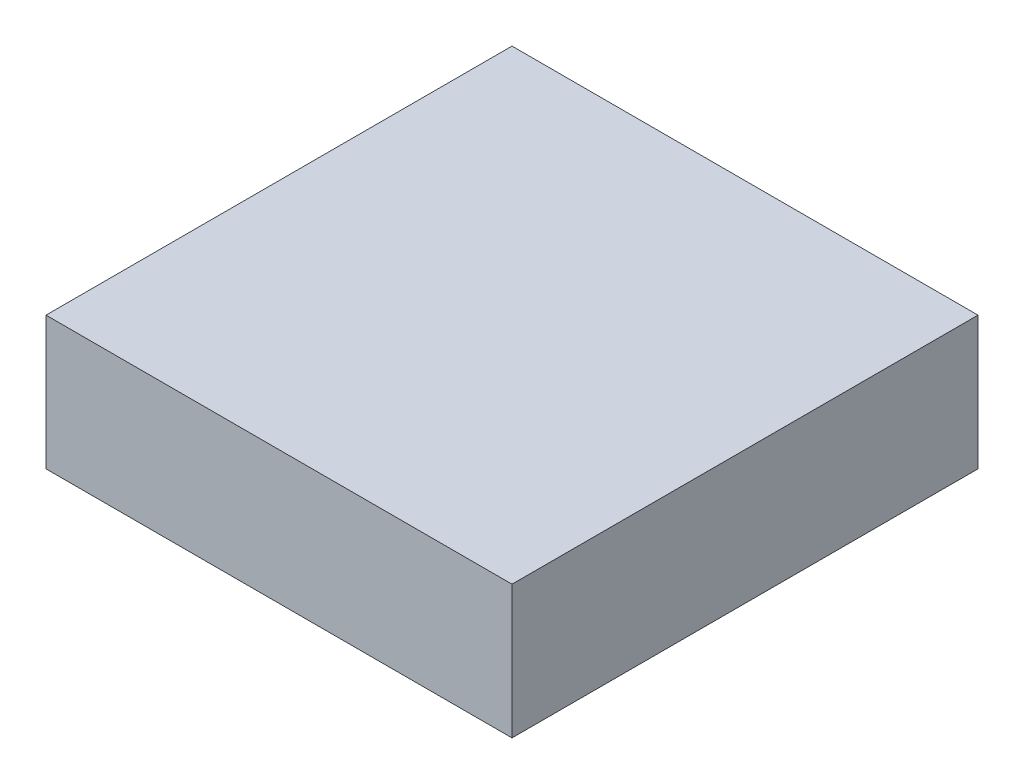
ISO-10303-21;
HEADER;
FILE_DESCRIPTION(('STEP AP214'),'2;1');
FILE_NAME('part.step','',(''),(''),'','','');
FILE_SCHEMA(('AUTOMOTIVE_DESIGN { 1 0 10303 214 1 1 1 1 }'));
ENDSEC;
DATA;
#1=APPLICATION_CONTEXT('core data for automotive mechanical design processes');
#2=APPLICATION_PROTOCOL_DEFINITION('international standard','automotive_design',2000,#1);
#3=PRODUCT_CONTEXT('',#1,'mechanical');
#4=PRODUCT('Part','Part','',(#3));
#5=PRODUCT_RELATED_PRODUCT_CATEGORY('part','',(#4));
#6=PRODUCT_DEFINITION_FORMATION('','',#4);
#7=PRODUCT_DEFINITION_CONTEXT('part definition',#1,'design');
#8=PRODUCT_DEFINITION('design','',#6,#7);
#9=PRODUCT_DEFINITION_SHAPE('','',#8);
#10=(LENGTH_UNIT() NAMED_UNIT(*) SI_UNIT(.MILLI.,.METRE.));
#11=(NAMED_UNIT(*) PLANE_ANGLE_UNIT() SI_UNIT($,.RADIAN.));
#12=(NAMED_UNIT(*) SI_UNIT($,.STERADIAN.) SOLID_ANGLE_UNIT());
#13=UNCERTAINTY_MEASURE_WITH_UNIT(LENGTH_MEASURE(1.E-05),#10,'distance_accuracy_value','');
#14=(GEOMETRIC_REPRESENTATION_CONTEXT(3) GLOBAL_UNCERTAINTY_ASSIGNED_CONTEXT((#13)) GLOBAL_UNIT_ASSIGNED_CONTEXT((#10,
#11,#12)) REPRESENTATION_CONTEXT('',''));
#15=CARTESIAN_POINT('',(0.,0.,0.));
#16=DIRECTION('',(0.,0.,1.));
#17=DIRECTION('',(1.,0.,0.));
#18=AXIS2_PLACEMENT_3D('',#15,#16,#17);
#19=CARTESIAN_POINT('',(35.,20.,-35.));
#20=DIRECTION('',(-1.,0.,0.));
#21=DIRECTION('',(0.,0.,1.));
#22=AXIS2_PLACEMENT_3D('',#19,#20,#21);
#23=PLANE('',#22);
#24=DIRECTION('',(0.,0.,-1.));
#25=VECTOR('',#24,1.);
#26=CARTESIAN_POINT('',(35.,0.,-35.));
#27=LINE('',#26,#25);
#28=CARTESIAN_POINT('',(35.,0.,35.));
#29=VERTEX_POINT('',#28);
#30=CARTESIAN_POINT('',(35.,0.,-35.));
#31=VERTEX_POINT('',#30);
#32=EDGE_CURVE('E141',#29,#31,#27,.T.);
#33=ORIENTED_EDGE('',*,*,#32,.T.);
#34=DIRECTION('',(0.,-1.,0.));
#35=VECTOR('',#34,1.);
#36=CARTESIAN_POINT('',(35.,20.,-35.));
#37=LINE('',#36,#35);
#38=CARTESIAN_POINT('',(35.,20.,-35.));
#39=VERTEX_POINT('',#38);
#40=EDGE_CURVE('E11',#39,#31,#37,.T.);
#41=ORIENTED_EDGE('',*,*,#40,.F.);
#42=DIRECTION('',(0.,0.,-1.));
#43=VECTOR('',#42,1.);
#44=CARTESIAN_POINT('',(35.,20.,-35.));
#45=LINE('',#44,#43);
#46=CARTESIAN_POINT('',(35.,20.,35.));
#47=VERTEX_POINT('',#46);
#48=EDGE_CURVE('E145',#47,#39,#45,.T.);
#49=ORIENTED_EDGE('',*,*,#48,.F.);
#50=DIRECTION('',(0.,-1.,0.));
#51=VECTOR('',#50,1.);
#52=CARTESIAN_POINT('',(35.,20.,35.));
#53=LINE('',#52,#51);
#54=EDGE_CURVE('E151',#47,#29,#53,.T.);
#55=ORIENTED_EDGE('',*,*,#54,.T.);
#56=EDGE_LOOP('',(#33,#41,#49,#55));
#57=FACE_BOUND('',#56,.T.);
#58=ADVANCED_FACE('F33',(#57),#23,.F.);
#59=CARTESIAN_POINT('',(-35.,20.,-35.));
#60=DIRECTION('',(0.,0.,1.));
#61=DIRECTION('',(1.,0.,0.));
#62=AXIS2_PLACEMENT_3D('',#59,#60,#61);
#63=PLANE('',#62);
#64=DIRECTION('',(-1.,0.,0.));
#65=VECTOR('',#64,1.);
#66=CARTESIAN_POINT('',(-35.,0.,-35.));
#67=LINE('',#66,#65);
#68=CARTESIAN_POINT('',(-35.,0.,-35.));
#69=VERTEX_POINT('',#68);
#70=EDGE_CURVE('E154',#31,#69,#67,.T.);
#71=ORIENTED_EDGE('',*,*,#70,.T.);
#72=DIRECTION('',(0.,-1.,0.));
#73=VECTOR('',#72,1.);
#74=CARTESIAN_POINT('',(-35.,20.,-35.));
#75=LINE('',#74,#73);
#76=CARTESIAN_POINT('',(-35.,20.,-35.));
#77=VERTEX_POINT('',#76);
#78=EDGE_CURVE('E40',#77,#69,#75,.T.);
#79=ORIENTED_EDGE('',*,*,#78,.F.);
#80=DIRECTION('',(-1.,0.,0.));
#81=VECTOR('',#80,1.);
#82=CARTESIAN_POINT('',(-35.,20.,-35.));
#83=LINE('',#82,#81);
#84=EDGE_CURVE('E84',#39,#77,#83,.T.);
#85=ORIENTED_EDGE('',*,*,#84,.F.);
#86=ORIENTED_EDGE('',*,*,#40,.T.);
#87=EDGE_LOOP('',(#71,#79,#85,#86));
#88=FACE_BOUND('',#87,.T.);
#89=ADVANCED_FACE('F182',(#88),#63,.F.);
#90=CARTESIAN_POINT('',(-35.,20.,-35.));
#91=DIRECTION('',(1.,0.,0.));
#92=DIRECTION('',(0.,0.,-1.));
#93=AXIS2_PLACEMENT_3D('',#90,#91,#92);
#94=PLANE('',#93);
#95=DIRECTION('',(0.,0.,1.));
#96=VECTOR('',#95,1.);
#97=CARTESIAN_POINT('',(-35.,0.,-35.));
#98=LINE('',#97,#96);
#99=CARTESIAN_POINT('',(-35.,0.,35.));
#100=VERTEX_POINT('',#99);
#101=EDGE_CURVE('E156',#69,#100,#98,.T.);
#102=ORIENTED_EDGE('',*,*,#101,.T.);
#103=DIRECTION('',(0.,-1.,0.));
#104=VECTOR('',#103,1.);
#105=CARTESIAN_POINT('',(-35.,20.,35.));
#106=LINE('',#105,#104);
#107=CARTESIAN_POINT('',(-35.,20.,35.));
#108=VERTEX_POINT('',#107);
#109=EDGE_CURVE('E160',#108,#100,#106,.T.);
#110=ORIENTED_EDGE('',*,*,#109,.F.);
#111=DIRECTION('',(0.,0.,1.));
#112=VECTOR('',#111,1.);
#113=CARTESIAN_POINT('',(-35.,20.,-35.));
#114=LINE('',#113,#112);
#115=EDGE_CURVE('E148',#77,#108,#114,.T.);
#116=ORIENTED_EDGE('',*,*,#115,.F.);
#117=ORIENTED_EDGE('',*,*,#78,.T.);
#118=EDGE_LOOP('',(#102,#110,#116,#117));
#119=FACE_BOUND('',#118,.T.);
#120=ADVANCED_FACE('F165',(#119),#94,.F.);
#121=CARTESIAN_POINT('',(-35.,20.,35.));
#122=DIRECTION('',(0.,0.,-1.));
#123=DIRECTION('',(-1.,0.,0.));
#124=AXIS2_PLACEMENT_3D('',#121,#122,#123);
#125=PLANE('',#124);
#126=DIRECTION('',(1.,0.,0.));
#127=VECTOR('',#126,1.);
#128=CARTESIAN_POINT('',(-35.,0.,35.));
#129=LINE('',#128,#127);
#130=EDGE_CURVE('E77',#100,#29,#129,.T.);
#131=ORIENTED_EDGE('',*,*,#130,.T.);
#132=ORIENTED_EDGE('',*,*,#54,.F.);
#133=DIRECTION('',(1.,0.,0.));
#134=VECTOR('',#133,1.);
#135=CARTESIAN_POINT('',(-35.,20.,35.));
#136=LINE('',#135,#134);
#137=EDGE_CURVE('E56',#108,#47,#136,.T.);
#138=ORIENTED_EDGE('',*,*,#137,.F.);
#139=ORIENTED_EDGE('',*,*,#109,.T.);
#140=EDGE_LOOP('',(#131,#132,#138,#139));
#141=FACE_BOUND('',#140,.T.);
#142=ADVANCED_FACE('F173',(#141),#125,.F.);
#143=CARTESIAN_POINT('',(0.,20.,0.));
#144=DIRECTION('',(0.,1.,0.));
#145=DIRECTION('',(0.,0.,1.));
#146=AXIS2_PLACEMENT_3D('',#143,#144,#145);
#147=PLANE('',#146);
#148=ORIENTED_EDGE('',*,*,#48,.T.);
#149=ORIENTED_EDGE('',*,*,#84,.T.);
#150=ORIENTED_EDGE('',*,*,#115,.T.);
#151=ORIENTED_EDGE('',*,*,#137,.T.);
#152=EDGE_LOOP('',(#148,#149,#150,#151));
#153=FACE_BOUND('',#152,.T.);
#154=ADVANCED_FACE('F175',(#153),#147,.T.);
#155=CARTESIAN_POINT('',(0.,0.,0.));
#156=DIRECTION('',(0.,1.,0.));
#157=DIRECTION('',(0.,0.,1.));
#158=AXIS2_PLACEMENT_3D('',#155,#156,#157);
#159=PLANE('',#158);
#160=DIRECTION('',(-1.,0.,0.));
#161=VECTOR('',#160,1.);
#162=CARTESIAN_POINT('',(-32.5,0.,32.5));
#163=LINE('',#162,#161);
#164=CARTESIAN_POINT('',(32.5,0.,32.5));
#165=VERTEX_POINT('',#164);
#166=CARTESIAN_POINT('',(-32.5,0.,32.5));
#167=VERTEX_POINT('',#166);
#168=EDGE_CURVE('E135',#165,#167,#163,.T.);
#169=ORIENTED_EDGE('',*,*,#168,.F.);
#170=DIRECTION('',(0.,0.,1.));
#171=VECTOR('',#170,1.);
#172=CARTESIAN_POINT('',(32.5,0.,32.5));
#173=LINE('',#172,#171);
#174=CARTESIAN_POINT('',(32.5,0.,-32.5));
#175=VERTEX_POINT('',#174);
#176=EDGE_CURVE('E47',#175,#165,#173,.T.);
#177=ORIENTED_EDGE('',*,*,#176,.F.);
#178=DIRECTION('',(1.,0.,0.));
#179=VECTOR('',#178,1.);
#180=CARTESIAN_POINT('',(-32.5,0.,-32.5));
#181=LINE('',#180,#179);
#182=CARTESIAN_POINT('',(-32.5,0.,-32.5));
#183=VERTEX_POINT('',#182);
#184=EDGE_CURVE('E126',#183,#175,#181,.T.);
#185=ORIENTED_EDGE('',*,*,#184,.F.);
#186=DIRECTION('',(0.,0.,-1.));
#187=VECTOR('',#186,1.);
#188=CARTESIAN_POINT('',(-32.5,0.,32.5));
#189=LINE('',#188,#187);
#190=EDGE_CURVE('E129',#167,#183,#189,.T.);
#191=ORIENTED_EDGE('',*,*,#190,.F.);
#192=EDGE_LOOP('',(#169,#177,#185,#191));
#193=FACE_BOUND('',#192,.T.);
#194=ORIENTED_EDGE('',*,*,#32,.F.);
#195=ORIENTED_EDGE('',*,*,#130,.F.);
#196=ORIENTED_EDGE('',*,*,#101,.F.);
#197=ORIENTED_EDGE('',*,*,#70,.F.);
#198=EDGE_LOOP('',(#194,#195,#196,#197));
#199=FACE_BOUND('',#198,.T.);
#200=ADVANCED_FACE('F169',(#193,#199),#159,.F.);
#201=CARTESIAN_POINT('',(32.5,15.,32.5));
#202=DIRECTION('',(1.,0.,0.));
#203=DIRECTION('',(0.,0.,-1.));
#204=AXIS2_PLACEMENT_3D('',#201,#202,#203);
#205=PLANE('',#204);
#206=ORIENTED_EDGE('',*,*,#176,.T.);
#207=DIRECTION('',(0.,-1.,0.));
#208=VECTOR('',#207,1.);
#209=CARTESIAN_POINT('',(32.5,15.,32.5));
#210=LINE('',#209,#208);
#211=CARTESIAN_POINT('',(32.5,15.,32.5));
#212=VERTEX_POINT('',#211);
#213=EDGE_CURVE('E104',#212,#165,#210,.T.);
#214=ORIENTED_EDGE('',*,*,#213,.F.);
#215=DIRECTION('',(0.,0.,1.));
#216=VECTOR('',#215,1.);
#217=CARTESIAN_POINT('',(32.5,15.,32.5));
#218=LINE('',#217,#216);
#219=CARTESIAN_POINT('',(32.5,15.,-32.5));
#220=VERTEX_POINT('',#219);
#221=EDGE_CURVE('E108',#220,#212,#218,.T.);
#222=ORIENTED_EDGE('',*,*,#221,.F.);
#223=DIRECTION('',(0.,-1.,0.));
#224=VECTOR('',#223,1.);
#225=CARTESIAN_POINT('',(32.5,15.,-32.5));
#226=LINE('',#225,#224);
#227=EDGE_CURVE('E139',#220,#175,#226,.T.);
#228=ORIENTED_EDGE('',*,*,#227,.T.);
#229=EDGE_LOOP('',(#206,#214,#222,#228));
#230=FACE_BOUND('',#229,.T.);
#231=ADVANCED_FACE('F106',(#230),#205,.F.);
#232=CARTESIAN_POINT('',(-32.5,15.,-32.5));
#233=DIRECTION('',(0.,0.,-1.));
#234=DIRECTION('',(-1.,0.,0.));
#235=AXIS2_PLACEMENT_3D('',#232,#233,#234);
#236=PLANE('',#235);
#237=ORIENTED_EDGE('',*,*,#184,.T.);
#238=ORIENTED_EDGE('',*,*,#227,.F.);
#239=DIRECTION('',(1.,0.,0.));
#240=VECTOR('',#239,1.);
#241=CARTESIAN_POINT('',(-32.5,15.,-32.5));
#242=LINE('',#241,#240);
#243=CARTESIAN_POINT('',(-32.5,15.,-32.5));
#244=VERTEX_POINT('',#243);
#245=EDGE_CURVE('E114',#244,#220,#242,.T.);
#246=ORIENTED_EDGE('',*,*,#245,.F.);
#247=DIRECTION('',(0.,-1.,0.));
#248=VECTOR('',#247,1.);
#249=CARTESIAN_POINT('',(-32.5,15.,-32.5));
#250=LINE('',#249,#248);
#251=EDGE_CURVE('E142',#244,#183,#250,.T.);
#252=ORIENTED_EDGE('',*,*,#251,.T.);
#253=EDGE_LOOP('',(#237,#238,#246,#252));
#254=FACE_BOUND('',#253,.T.);
#255=ADVANCED_FACE('F222',(#254),#236,.F.);
#256=CARTESIAN_POINT('',(-32.5,15.,32.5));
#257=DIRECTION('',(-1.,0.,0.));
#258=DIRECTION('',(0.,0.,1.));
#259=AXIS2_PLACEMENT_3D('',#256,#257,#258);
#260=PLANE('',#259);
#261=ORIENTED_EDGE('',*,*,#190,.T.);
#262=ORIENTED_EDGE('',*,*,#251,.F.);
#263=DIRECTION('',(0.,0.,-1.));
#264=VECTOR('',#263,1.);
#265=CARTESIAN_POINT('',(-32.5,15.,32.5));
#266=LINE('',#265,#264);
#267=CARTESIAN_POINT('',(-32.5,15.,32.5));
#268=VERTEX_POINT('',#267);
#269=EDGE_CURVE('E122',#268,#244,#266,.T.);
#270=ORIENTED_EDGE('',*,*,#269,.F.);
#271=DIRECTION('',(0.,-1.,0.));
#272=VECTOR('',#271,1.);
#273=CARTESIAN_POINT('',(-32.5,15.,32.5));
#274=LINE('',#273,#272);
#275=EDGE_CURVE('E113',#268,#167,#274,.T.);
#276=ORIENTED_EDGE('',*,*,#275,.T.);
#277=EDGE_LOOP('',(#261,#262,#270,#276));
#278=FACE_BOUND('',#277,.T.);
#279=ADVANCED_FACE('F231',(#278),#260,.F.);
#280=CARTESIAN_POINT('',(-32.5,15.,32.5));
#281=DIRECTION('',(0.,0.,1.));
#282=DIRECTION('',(1.,0.,0.));
#283=AXIS2_PLACEMENT_3D('',#280,#281,#282);
#284=PLANE('',#283);
#285=ORIENTED_EDGE('',*,*,#168,.T.);
#286=ORIENTED_EDGE('',*,*,#275,.F.);
#287=DIRECTION('',(-1.,0.,0.));
#288=VECTOR('',#287,1.);
#289=CARTESIAN_POINT('',(-32.5,15.,32.5));
#290=LINE('',#289,#288);
#291=EDGE_CURVE('E117',#212,#268,#290,.T.);
#292=ORIENTED_EDGE('',*,*,#291,.F.);
#293=ORIENTED_EDGE('',*,*,#213,.T.);
#294=EDGE_LOOP('',(#285,#286,#292,#293));
#295=FACE_BOUND('',#294,.T.);
#296=ADVANCED_FACE('F118',(#295),#284,.F.);
#297=CARTESIAN_POINT('',(0.,15.,0.));
#298=DIRECTION('',(0.,-1.,0.));
#299=DIRECTION('',(0.,0.,-1.));
#300=AXIS2_PLACEMENT_3D('',#297,#298,#299);
#301=PLANE('',#300);
#302=ORIENTED_EDGE('',*,*,#221,.T.);
#303=ORIENTED_EDGE('',*,*,#291,.T.);
#304=ORIENTED_EDGE('',*,*,#269,.T.);
#305=ORIENTED_EDGE('',*,*,#245,.T.);
#306=EDGE_LOOP('',(#302,#303,#304,#305));
#307=FACE_BOUND('',#306,.T.);
#308=ADVANCED_FACE('F124',(#307),#301,.T.);
#309=CLOSED_SHELL('',(#58,#89,#120,#142,#154,#200,#231,#255,#279,#296,#308));
#310=MANIFOLD_SOLID_BREP('B2',#309);
#311=ADVANCED_BREP_SHAPE_REPRESENTATION('',(#18,#310),#14);
#312=SHAPE_DEFINITION_REPRESENTATION(#9,#311);
ENDSEC;
END-ISO-10303-21;
